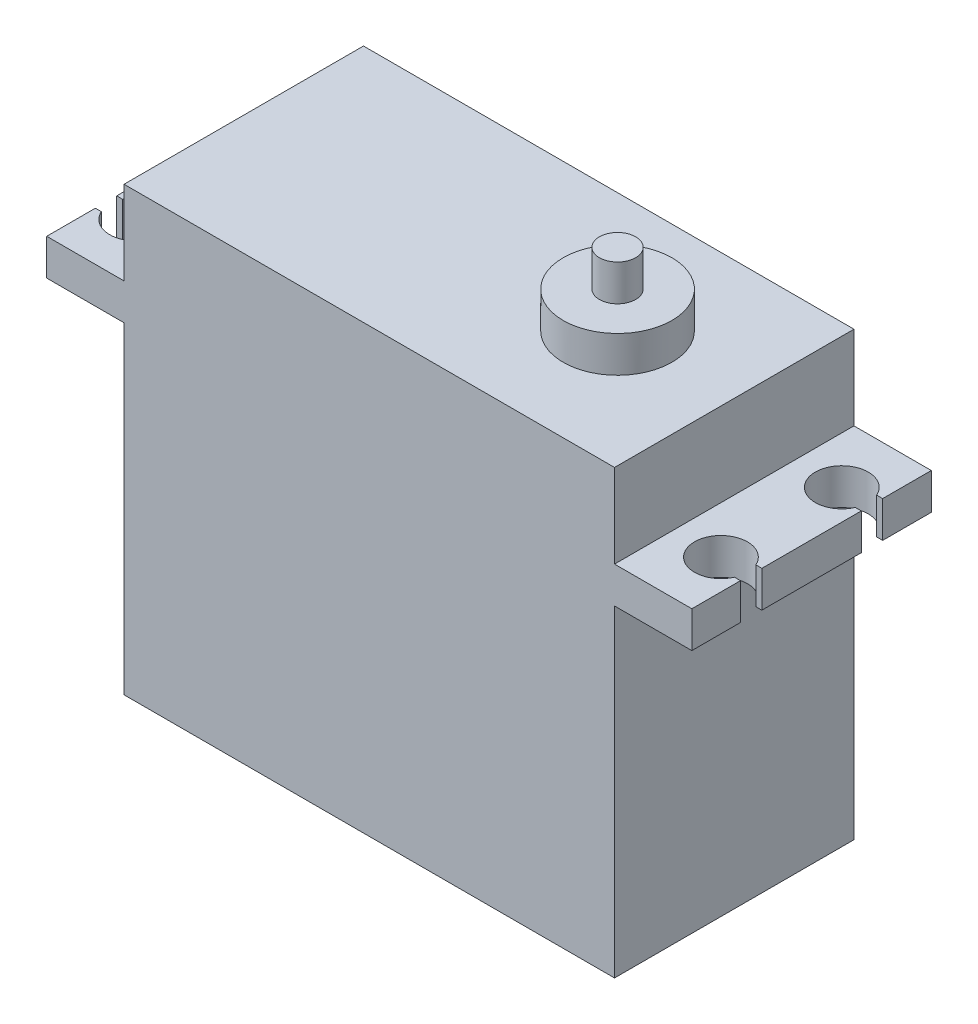
ISO-10303-21;
HEADER;
FILE_DESCRIPTION(('STEP AP214'),'2;1');
FILE_NAME('part.step','',(''),(''),'','','');
FILE_SCHEMA(('AUTOMOTIVE_DESIGN { 1 0 10303 214 1 1 1 1 }'));
ENDSEC;
DATA;
#1=APPLICATION_CONTEXT('core data for automotive mechanical design processes');
#2=APPLICATION_PROTOCOL_DEFINITION('international standard','automotive_design',2000,#1);
#3=PRODUCT_CONTEXT('',#1,'mechanical');
#4=PRODUCT('Part','Part','',(#3));
#5=PRODUCT_RELATED_PRODUCT_CATEGORY('part','',(#4));
#6=PRODUCT_DEFINITION_FORMATION('','',#4);
#7=PRODUCT_DEFINITION_CONTEXT('part definition',#1,'design');
#8=PRODUCT_DEFINITION('design','',#6,#7);
#9=PRODUCT_DEFINITION_SHAPE('','',#8);
#10=(LENGTH_UNIT() NAMED_UNIT(*) SI_UNIT(.MILLI.,.METRE.));
#11=(NAMED_UNIT(*) PLANE_ANGLE_UNIT() SI_UNIT($,.RADIAN.));
#12=(NAMED_UNIT(*) SI_UNIT($,.STERADIAN.) SOLID_ANGLE_UNIT());
#13=UNCERTAINTY_MEASURE_WITH_UNIT(LENGTH_MEASURE(1.E-05),#10,'distance_accuracy_value','');
#14=(GEOMETRIC_REPRESENTATION_CONTEXT(3) GLOBAL_UNCERTAINTY_ASSIGNED_CONTEXT((#13)) GLOBAL_UNIT_ASSIGNED_CONTEXT((#10,
#11,#12)) REPRESENTATION_CONTEXT('',''));
#15=CARTESIAN_POINT('',(0.,0.,0.));
#16=DIRECTION('',(0.,0.,1.));
#17=DIRECTION('',(1.,0.,0.));
#18=AXIS2_PLACEMENT_3D('',#15,#16,#17);
#19=CARTESIAN_POINT('',(0.,36.6,0.));
#20=DIRECTION('',(0.,-1.,0.));
#21=DIRECTION('',(0.,0.,-1.));
#22=AXIS2_PLACEMENT_3D('',#19,#20,#21);
#23=PLANE('',#22);
#24=DIRECTION('',(0.,0.,1.));
#25=VECTOR('',#24,1.);
#26=CARTESIAN_POINT('',(-46.3906393290634,36.6,5.61978732543846));
#27=LINE('',#26,#25);
#28=CARTESIAN_POINT('',(-46.3906393290634,36.6,5.61978732543846));
#29=VERTEX_POINT('',#28);
#30=CARTESIAN_POINT('',(-46.3906393290634,36.6,25.4397873254385));
#31=VERTEX_POINT('',#30);
#32=EDGE_CURVE('E402',#29,#31,#27,.T.);
#33=ORIENTED_EDGE('',*,*,#32,.T.);
#34=DIRECTION('',(1.,0.,0.));
#35=VECTOR('',#34,1.);
#36=CARTESIAN_POINT('',(-5.7906393290634,36.6,25.4397873254385));
#37=LINE('',#36,#35);
#38=CARTESIAN_POINT('',(-5.7906393290634,36.6,25.4397873254385));
#39=VERTEX_POINT('',#38);
#40=EDGE_CURVE('E405',#31,#39,#37,.T.);
#41=ORIENTED_EDGE('',*,*,#40,.T.);
#42=DIRECTION('',(0.,0.,-1.));
#43=VECTOR('',#42,1.);
#44=CARTESIAN_POINT('',(-5.7906393290634,36.6,5.61978732543845));
#45=LINE('',#44,#43);
#46=CARTESIAN_POINT('',(-5.7906393290634,36.6,5.61978732543845));
#47=VERTEX_POINT('',#46);
#48=EDGE_CURVE('E408',#39,#47,#45,.T.);
#49=ORIENTED_EDGE('',*,*,#48,.T.);
#50=DIRECTION('',(-1.,0.,0.));
#51=VECTOR('',#50,1.);
#52=CARTESIAN_POINT('',(-5.7906393290634,36.6,5.61978732543845));
#53=LINE('',#52,#51);
#54=EDGE_CURVE('E410',#47,#29,#53,.T.);
#55=ORIENTED_EDGE('',*,*,#54,.T.);
#56=EDGE_LOOP('',(#33,#41,#49,#55));
#57=FACE_BOUND('',#56,.T.);
#58=CARTESIAN_POINT('',(-15.4506393290634,36.6,15.5297873254385));
#59=DIRECTION('',(0.,-1.,0.));
#60=DIRECTION('',(0.,0.,-1.));
#61=AXIS2_PLACEMENT_3D('',#58,#59,#60);
#62=CIRCLE('',#61,4.5);
#63=CARTESIAN_POINT('',(-15.4506393290634,36.6,11.0297873254385));
#64=VERTEX_POINT('',#63);
#65=EDGE_CURVE('E11',#64,#64,#62,.F.);
#66=ORIENTED_EDGE('',*,*,#65,.F.);
#67=EDGE_LOOP('',(#66));
#68=FACE_BOUND('',#67,.T.);
#69=ADVANCED_FACE('F35',(#57,#68),#23,.F.);
#70=CARTESIAN_POINT('',(-5.7906393290634,36.6,5.61978732543845));
#71=DIRECTION('',(-1.,0.,0.));
#72=DIRECTION('',(0.,0.,1.));
#73=AXIS2_PLACEMENT_3D('',#70,#71,#72);
#74=PLANE('',#73);
#75=DIRECTION('',(0.,0.,1.));
#76=VECTOR('',#75,1.);
#77=CARTESIAN_POINT('',(-5.7906393290634,29.67,0.));
#78=LINE('',#77,#76);
#79=CARTESIAN_POINT('',(-5.7906393290634,29.67,5.61978732543845));
#80=VERTEX_POINT('',#79);
#81=CARTESIAN_POINT('',(-5.7906393290634,29.67,25.4397873254385));
#82=VERTEX_POINT('',#81);
#83=EDGE_CURVE('E254',#80,#82,#78,.T.);
#84=ORIENTED_EDGE('',*,*,#83,.F.);
#85=DIRECTION('',(0.,-1.,0.));
#86=VECTOR('',#85,1.);
#87=CARTESIAN_POINT('',(-5.7906393290634,36.6,5.61978732543845));
#88=LINE('',#87,#86);
#89=EDGE_CURVE('E436',#47,#80,#88,.T.);
#90=ORIENTED_EDGE('',*,*,#89,.F.);
#91=ORIENTED_EDGE('',*,*,#48,.F.);
#92=DIRECTION('',(0.,-1.,0.));
#93=VECTOR('',#92,1.);
#94=CARTESIAN_POINT('',(-5.7906393290634,36.6,25.4397873254385));
#95=LINE('',#94,#93);
#96=EDGE_CURVE('E429',#39,#82,#95,.T.);
#97=ORIENTED_EDGE('',*,*,#96,.T.);
#98=EDGE_LOOP('',(#84,#90,#91,#97));
#99=FACE_BOUND('',#98,.T.);
#100=ADVANCED_FACE('F505',(#99),#74,.F.);
#101=CARTESIAN_POINT('',(-46.3906393290634,36.6,5.61978732543846));
#102=DIRECTION('',(1.,0.,0.));
#103=DIRECTION('',(0.,0.,-1.));
#104=AXIS2_PLACEMENT_3D('',#101,#102,#103);
#105=PLANE('',#104);
#106=DIRECTION('',(0.,0.,-1.));
#107=VECTOR('',#106,1.);
#108=CARTESIAN_POINT('',(-46.3906393290634,29.67,0.));
#109=LINE('',#108,#107);
#110=CARTESIAN_POINT('',(-46.3906393290634,29.67,25.4397873254385));
#111=VERTEX_POINT('',#110);
#112=CARTESIAN_POINT('',(-46.3906393290634,29.67,5.61978732543846));
#113=VERTEX_POINT('',#112);
#114=EDGE_CURVE('E339',#111,#113,#109,.T.);
#115=ORIENTED_EDGE('',*,*,#114,.F.);
#116=DIRECTION('',(0.,-1.,0.));
#117=VECTOR('',#116,1.);
#118=CARTESIAN_POINT('',(-46.3906393290634,36.6,25.4397873254385));
#119=LINE('',#118,#117);
#120=EDGE_CURVE('E43',#31,#111,#119,.T.);
#121=ORIENTED_EDGE('',*,*,#120,.F.);
#122=ORIENTED_EDGE('',*,*,#32,.F.);
#123=DIRECTION('',(0.,-1.,0.));
#124=VECTOR('',#123,1.);
#125=CARTESIAN_POINT('',(-46.3906393290634,36.6,5.61978732543846));
#126=LINE('',#125,#124);
#127=EDGE_CURVE('E424',#29,#113,#126,.T.);
#128=ORIENTED_EDGE('',*,*,#127,.T.);
#129=EDGE_LOOP('',(#115,#121,#122,#128));
#130=FACE_BOUND('',#129,.T.);
#131=ADVANCED_FACE('F511',(#130),#105,.F.);
#132=CARTESIAN_POINT('',(-46.3906393290634,26.67,25.4397873254385));
#133=VERTEX_POINT('',#132);
#134=CARTESIAN_POINT('',(-46.3906393290634,0.,25.4397873254385));
#135=VERTEX_POINT('',#134);
#136=EDGE_CURVE('E426',#133,#135,#119,.T.);
#137=ORIENTED_EDGE('',*,*,#136,.F.);
#138=DIRECTION('',(0.,0.,-1.));
#139=VECTOR('',#138,1.);
#140=CARTESIAN_POINT('',(-46.3906393290634,26.67,0.));
#141=LINE('',#140,#139);
#142=CARTESIAN_POINT('',(-46.3906393290634,26.67,5.61978732543846));
#143=VERTEX_POINT('',#142);
#144=EDGE_CURVE('E359',#133,#143,#141,.T.);
#145=ORIENTED_EDGE('',*,*,#144,.T.);
#146=CARTESIAN_POINT('',(-46.3906393290634,0.,5.61978732543846));
#147=VERTEX_POINT('',#146);
#148=EDGE_CURVE('E344',#143,#147,#126,.T.);
#149=ORIENTED_EDGE('',*,*,#148,.T.);
#150=DIRECTION('',(0.,0.,1.));
#151=VECTOR('',#150,1.);
#152=CARTESIAN_POINT('',(-46.3906393290634,0.,5.61978732543846));
#153=LINE('',#152,#151);
#154=EDGE_CURVE('E401',#147,#135,#153,.T.);
#155=ORIENTED_EDGE('',*,*,#154,.T.);
#156=EDGE_LOOP('',(#137,#145,#149,#155));
#157=FACE_BOUND('',#156,.T.);
#158=ADVANCED_FACE('F37',(#157),#105,.F.);
#159=CARTESIAN_POINT('',(-5.7906393290634,36.6,25.4397873254385));
#160=DIRECTION('',(0.,0.,-1.));
#161=DIRECTION('',(-1.,0.,0.));
#162=AXIS2_PLACEMENT_3D('',#159,#160,#161);
#163=PLANE('',#162);
#164=DIRECTION('',(1.,0.,0.));
#165=VECTOR('',#164,1.);
#166=CARTESIAN_POINT('',(-5.7906393290634,0.,25.4397873254385));
#167=LINE('',#166,#165);
#168=CARTESIAN_POINT('',(-5.7906393290634,0.,25.4397873254385));
#169=VERTEX_POINT('',#168);
#170=EDGE_CURVE('E414',#135,#169,#167,.T.);
#171=ORIENTED_EDGE('',*,*,#170,.T.);
#172=CARTESIAN_POINT('',(-5.7906393290634,26.67,25.4397873254385));
#173=VERTEX_POINT('',#172);
#174=EDGE_CURVE('E259',#173,#169,#95,.T.);
#175=ORIENTED_EDGE('',*,*,#174,.F.);
#176=DIRECTION('',(1.,0.,0.));
#177=VECTOR('',#176,1.);
#178=CARTESIAN_POINT('',(0.,26.67,25.4397873254385));
#179=LINE('',#178,#177);
#180=CARTESIAN_POINT('',(0.609360670936598,26.67,25.4397873254385));
#181=VERTEX_POINT('',#180);
#182=EDGE_CURVE('E272',#173,#181,#179,.T.);
#183=ORIENTED_EDGE('',*,*,#182,.T.);
#184=DIRECTION('',(0.,-1.,0.));
#185=VECTOR('',#184,1.);
#186=CARTESIAN_POINT('',(0.609360670936598,29.67,25.4397873254385));
#187=LINE('',#186,#185);
#188=CARTESIAN_POINT('',(0.609360670936598,29.67,25.4397873254385));
#189=VERTEX_POINT('',#188);
#190=EDGE_CURVE('E310',#189,#181,#187,.T.);
#191=ORIENTED_EDGE('',*,*,#190,.F.);
#192=DIRECTION('',(1.,0.,0.));
#193=VECTOR('',#192,1.);
#194=CARTESIAN_POINT('',(0.,29.67,25.4397873254385));
#195=LINE('',#194,#193);
#196=EDGE_CURVE('E245',#82,#189,#195,.T.);
#197=ORIENTED_EDGE('',*,*,#196,.F.);
#198=ORIENTED_EDGE('',*,*,#96,.F.);
#199=ORIENTED_EDGE('',*,*,#40,.F.);
#200=ORIENTED_EDGE('',*,*,#120,.T.);
#201=DIRECTION('',(1.,0.,0.));
#202=VECTOR('',#201,1.);
#203=CARTESIAN_POINT('',(0.,29.67,25.4397873254385));
#204=LINE('',#203,#202);
#205=CARTESIAN_POINT('',(-52.7906393290634,29.67,25.4397873254385));
#206=VERTEX_POINT('',#205);
#207=EDGE_CURVE('E343',#206,#111,#204,.T.);
#208=ORIENTED_EDGE('',*,*,#207,.F.);
#209=DIRECTION('',(0.,-1.,0.));
#210=VECTOR('',#209,1.);
#211=CARTESIAN_POINT('',(-52.7906393290634,29.67,25.4397873254385));
#212=LINE('',#211,#210);
#213=CARTESIAN_POINT('',(-52.7906393290634,26.67,25.4397873254385));
#214=VERTEX_POINT('',#213);
#215=EDGE_CURVE('E381',#206,#214,#212,.T.);
#216=ORIENTED_EDGE('',*,*,#215,.T.);
#217=DIRECTION('',(1.,0.,0.));
#218=VECTOR('',#217,1.);
#219=CARTESIAN_POINT('',(0.,26.67,25.4397873254385));
#220=LINE('',#219,#218);
#221=EDGE_CURVE('E355',#214,#133,#220,.T.);
#222=ORIENTED_EDGE('',*,*,#221,.T.);
#223=ORIENTED_EDGE('',*,*,#136,.T.);
#224=EDGE_LOOP('',(#171,#175,#183,#191,#197,#198,#199,#200,#208,#216,#222,#223));
#225=FACE_BOUND('',#224,.T.);
#226=ADVANCED_FACE('F450',(#225),#163,.F.);
#227=CARTESIAN_POINT('',(-5.7906393290634,26.67,5.61978732543845));
#228=VERTEX_POINT('',#227);
#229=CARTESIAN_POINT('',(-5.7906393290634,0.,5.61978732543845));
#230=VERTEX_POINT('',#229);
#231=EDGE_CURVE('E55',#228,#230,#88,.T.);
#232=ORIENTED_EDGE('',*,*,#231,.F.);
#233=DIRECTION('',(0.,0.,1.));
#234=VECTOR('',#233,1.);
#235=CARTESIAN_POINT('',(-5.7906393290634,26.67,0.));
#236=LINE('',#235,#234);
#237=EDGE_CURVE('E50',#228,#173,#236,.T.);
#238=ORIENTED_EDGE('',*,*,#237,.T.);
#239=ORIENTED_EDGE('',*,*,#174,.T.);
#240=DIRECTION('',(0.,0.,-1.));
#241=VECTOR('',#240,1.);
#242=CARTESIAN_POINT('',(-5.7906393290634,0.,5.61978732543845));
#243=LINE('',#242,#241);
#244=EDGE_CURVE('E417',#169,#230,#243,.T.);
#245=ORIENTED_EDGE('',*,*,#244,.T.);
#246=EDGE_LOOP('',(#232,#238,#239,#245));
#247=FACE_BOUND('',#246,.T.);
#248=ADVANCED_FACE('F443',(#247),#74,.F.);
#249=CARTESIAN_POINT('',(-5.7906393290634,36.6,5.61978732543845));
#250=DIRECTION('',(0.,0.,1.));
#251=DIRECTION('',(1.,0.,0.));
#252=AXIS2_PLACEMENT_3D('',#249,#250,#251);
#253=PLANE('',#252);
#254=DIRECTION('',(-1.,0.,0.));
#255=VECTOR('',#254,1.);
#256=CARTESIAN_POINT('',(-5.7906393290634,0.,5.61978732543845));
#257=LINE('',#256,#255);
#258=EDGE_CURVE('E406',#230,#147,#257,.T.);
#259=ORIENTED_EDGE('',*,*,#258,.T.);
#260=ORIENTED_EDGE('',*,*,#148,.F.);
#261=DIRECTION('',(1.,0.,0.));
#262=VECTOR('',#261,1.);
#263=CARTESIAN_POINT('',(0.,26.67,5.61978732543846));
#264=LINE('',#263,#262);
#265=CARTESIAN_POINT('',(-52.7906393290634,26.67,5.61978732543846));
#266=VERTEX_POINT('',#265);
#267=EDGE_CURVE('E364',#266,#143,#264,.T.);
#268=ORIENTED_EDGE('',*,*,#267,.F.);
#269=DIRECTION('',(0.,-1.,0.));
#270=VECTOR('',#269,1.);
#271=CARTESIAN_POINT('',(-52.7906393290634,29.67,5.61978732543846));
#272=LINE('',#271,#270);
#273=CARTESIAN_POINT('',(-52.7906393290634,29.67,5.61978732543846));
#274=VERTEX_POINT('',#273);
#275=EDGE_CURVE('E383',#274,#266,#272,.T.);
#276=ORIENTED_EDGE('',*,*,#275,.F.);
#277=DIRECTION('',(1.,0.,0.));
#278=VECTOR('',#277,1.);
#279=CARTESIAN_POINT('',(0.,29.67,5.61978732543846));
#280=LINE('',#279,#278);
#281=EDGE_CURVE('E333',#274,#113,#280,.T.);
#282=ORIENTED_EDGE('',*,*,#281,.T.);
#283=ORIENTED_EDGE('',*,*,#127,.F.);
#284=ORIENTED_EDGE('',*,*,#54,.F.);
#285=ORIENTED_EDGE('',*,*,#89,.T.);
#286=DIRECTION('',(1.,0.,0.));
#287=VECTOR('',#286,1.);
#288=CARTESIAN_POINT('',(0.,29.67,5.61978732543846));
#289=LINE('',#288,#287);
#290=CARTESIAN_POINT('',(0.6093606709366,29.67,5.61978732543846));
#291=VERTEX_POINT('',#290);
#292=EDGE_CURVE('E258',#80,#291,#289,.T.);
#293=ORIENTED_EDGE('',*,*,#292,.T.);
#294=DIRECTION('',(0.,-1.,0.));
#295=VECTOR('',#294,1.);
#296=CARTESIAN_POINT('',(0.6093606709366,29.67,5.61978732543846));
#297=LINE('',#296,#295);
#298=CARTESIAN_POINT('',(0.6093606709366,26.67,5.61978732543846));
#299=VERTEX_POINT('',#298);
#300=EDGE_CURVE('E308',#291,#299,#297,.T.);
#301=ORIENTED_EDGE('',*,*,#300,.T.);
#302=DIRECTION('',(1.,0.,0.));
#303=VECTOR('',#302,1.);
#304=CARTESIAN_POINT('',(0.,26.67,5.61978732543846));
#305=LINE('',#304,#303);
#306=EDGE_CURVE('E271',#228,#299,#305,.T.);
#307=ORIENTED_EDGE('',*,*,#306,.F.);
#308=ORIENTED_EDGE('',*,*,#231,.T.);
#309=EDGE_LOOP('',(#259,#260,#268,#276,#282,#283,#284,#285,#293,#301,#307,#308));
#310=FACE_BOUND('',#309,.T.);
#311=ADVANCED_FACE('F455',(#310),#253,.F.);
#312=CARTESIAN_POINT('',(0.,0.,0.));
#313=DIRECTION('',(0.,-1.,0.));
#314=DIRECTION('',(0.,0.,-1.));
#315=AXIS2_PLACEMENT_3D('',#312,#313,#314);
#316=PLANE('',#315);
#317=ORIENTED_EDGE('',*,*,#154,.F.);
#318=ORIENTED_EDGE('',*,*,#258,.F.);
#319=ORIENTED_EDGE('',*,*,#244,.F.);
#320=ORIENTED_EDGE('',*,*,#170,.F.);
#321=EDGE_LOOP('',(#317,#318,#319,#320));
#322=FACE_BOUND('',#321,.T.);
#323=ADVANCED_FACE('F453',(#322),#316,.T.);
#324=CARTESIAN_POINT('',(-50.2906393290634,29.67,20.5297873254385));
#325=DIRECTION('',(0.,-1.,0.));
#326=DIRECTION('',(0.,0.,-1.));
#327=AXIS2_PLACEMENT_3D('',#324,#325,#326);
#328=CYLINDRICAL_SURFACE('',#327,2.19);
#329=CARTESIAN_POINT('',(-50.2906393290634,26.67,20.5297873254385));
#330=DIRECTION('',(0.,-1.,0.));
#331=DIRECTION('',(0.,0.,-1.));
#332=AXIS2_PLACEMENT_3D('',#329,#330,#331);
#333=CIRCLE('',#332,2.19);
#334=CARTESIAN_POINT('',(-52.2939527174455,26.67,19.6450074274249));
#335=VERTEX_POINT('',#334);
#336=CARTESIAN_POINT('',(-52.2939527174455,26.67,21.414567223452));
#337=VERTEX_POINT('',#336);
#338=EDGE_CURVE('E296',#335,#337,#333,.T.);
#339=ORIENTED_EDGE('',*,*,#338,.T.);
#340=DIRECTION('',(0.,-1.,0.));
#341=VECTOR('',#340,1.);
#342=CARTESIAN_POINT('',(-52.2939527174455,29.67,21.414567223452));
#343=LINE('',#342,#341);
#344=CARTESIAN_POINT('',(-52.2939527174455,29.67,21.414567223452));
#345=VERTEX_POINT('',#344);
#346=EDGE_CURVE('E375',#345,#337,#343,.T.);
#347=ORIENTED_EDGE('',*,*,#346,.F.);
#348=CARTESIAN_POINT('',(-50.2906393290634,29.67,20.5297873254385));
#349=DIRECTION('',(0.,-1.,0.));
#350=DIRECTION('',(0.,0.,-1.));
#351=AXIS2_PLACEMENT_3D('',#348,#349,#350);
#352=CIRCLE('',#351,2.19);
#353=CARTESIAN_POINT('',(-52.2939527174455,29.67,19.6450074274249));
#354=VERTEX_POINT('',#353);
#355=EDGE_CURVE('E313',#354,#345,#352,.T.);
#356=ORIENTED_EDGE('',*,*,#355,.F.);
#357=DIRECTION('',(0.,-1.,0.));
#358=VECTOR('',#357,1.);
#359=CARTESIAN_POINT('',(-52.2939527174455,29.67,19.6450074274249));
#360=LINE('',#359,#358);
#361=EDGE_CURVE('E396',#354,#335,#360,.T.);
#362=ORIENTED_EDGE('',*,*,#361,.T.);
#363=EDGE_LOOP('',(#339,#347,#356,#362));
#364=FACE_BOUND('',#363,.T.);
#365=ADVANCED_FACE('F520',(#364),#328,.F.);
#366=CARTESIAN_POINT('',(-1.49584674204944E-13,29.67,21.4145672234524));
#367=DIRECTION('',(0.,0.,1.));
#368=DIRECTION('',(1.,0.,0.));
#369=AXIS2_PLACEMENT_3D('',#366,#367,#368);
#370=PLANE('',#369);
#371=DIRECTION('',(-1.,0.,0.));
#372=VECTOR('',#371,1.);
#373=CARTESIAN_POINT('',(-1.49584674204944E-13,26.67,21.4145672234524));
#374=LINE('',#373,#372);
#375=CARTESIAN_POINT('',(-52.7906393290634,26.67,21.414567223452));
#376=VERTEX_POINT('',#375);
#377=EDGE_CURVE('E317',#337,#376,#374,.T.);
#378=ORIENTED_EDGE('',*,*,#377,.T.);
#379=DIRECTION('',(0.,-1.,0.));
#380=VECTOR('',#379,1.);
#381=CARTESIAN_POINT('',(-52.7906393290634,29.67,21.414567223452));
#382=LINE('',#381,#380);
#383=CARTESIAN_POINT('',(-52.7906393290634,29.67,21.414567223452));
#384=VERTEX_POINT('',#383);
#385=EDGE_CURVE('E379',#384,#376,#382,.T.);
#386=ORIENTED_EDGE('',*,*,#385,.F.);
#387=DIRECTION('',(-1.,0.,0.));
#388=VECTOR('',#387,1.);
#389=CARTESIAN_POINT('',(-1.49584674204944E-13,29.67,21.4145672234524));
#390=LINE('',#389,#388);
#391=EDGE_CURVE('E398',#345,#384,#390,.T.);
#392=ORIENTED_EDGE('',*,*,#391,.F.);
#393=ORIENTED_EDGE('',*,*,#346,.T.);
#394=EDGE_LOOP('',(#378,#386,#392,#393));
#395=FACE_BOUND('',#394,.T.);
#396=ADVANCED_FACE('F597',(#395),#370,.F.);
#397=CARTESIAN_POINT('',(-52.7906393290634,29.67,0.));
#398=DIRECTION('',(-1.,0.,0.));
#399=DIRECTION('',(0.,0.,1.));
#400=AXIS2_PLACEMENT_3D('',#397,#398,#399);
#401=PLANE('',#400);
#402=DIRECTION('',(0.,0.,-1.));
#403=VECTOR('',#402,1.);
#404=CARTESIAN_POINT('',(-52.7906393290634,26.67,0.));
#405=LINE('',#404,#403);
#406=EDGE_CURVE('E358',#214,#376,#405,.T.);
#407=ORIENTED_EDGE('',*,*,#406,.F.);
#408=ORIENTED_EDGE('',*,*,#215,.F.);
#409=DIRECTION('',(0.,0.,-1.));
#410=VECTOR('',#409,1.);
#411=CARTESIAN_POINT('',(-52.7906393290634,29.67,0.));
#412=LINE('',#411,#410);
#413=EDGE_CURVE('E336',#206,#384,#412,.T.);
#414=ORIENTED_EDGE('',*,*,#413,.T.);
#415=ORIENTED_EDGE('',*,*,#385,.T.);
#416=EDGE_LOOP('',(#407,#408,#414,#415));
#417=FACE_BOUND('',#416,.T.);
#418=ADVANCED_FACE('F563',(#417),#401,.T.);
#419=CARTESIAN_POINT('',(-52.7906393290634,29.67,0.));
#420=DIRECTION('',(-1.,0.,0.));
#421=DIRECTION('',(0.,0.,1.));
#422=AXIS2_PLACEMENT_3D('',#419,#420,#421);
#423=PLANE('',#422);
#424=DIRECTION('',(0.,0.,-1.));
#425=VECTOR('',#424,1.);
#426=CARTESIAN_POINT('',(-52.7906393290634,26.67,0.));
#427=LINE('',#426,#425);
#428=CARTESIAN_POINT('',(-52.7906393290634,26.67,9.64500742742492));
#429=VERTEX_POINT('',#428);
#430=EDGE_CURVE('E369',#429,#266,#427,.T.);
#431=ORIENTED_EDGE('',*,*,#430,.F.);
#432=DIRECTION('',(0.,-1.,0.));
#433=VECTOR('',#432,1.);
#434=CARTESIAN_POINT('',(-52.7906393290634,29.67,9.64500742742492));
#435=LINE('',#434,#433);
#436=CARTESIAN_POINT('',(-52.7906393290634,29.67,9.64500742742492));
#437=VERTEX_POINT('',#436);
#438=EDGE_CURVE('E385',#437,#429,#435,.T.);
#439=ORIENTED_EDGE('',*,*,#438,.F.);
#440=DIRECTION('',(0.,0.,-1.));
#441=VECTOR('',#440,1.);
#442=CARTESIAN_POINT('',(-52.7906393290634,29.67,0.));
#443=LINE('',#442,#441);
#444=EDGE_CURVE('E330',#437,#274,#443,.T.);
#445=ORIENTED_EDGE('',*,*,#444,.T.);
#446=ORIENTED_EDGE('',*,*,#275,.T.);
#447=EDGE_LOOP('',(#431,#439,#445,#446));
#448=FACE_BOUND('',#447,.T.);
#449=ADVANCED_FACE('F573',(#448),#423,.T.);
#450=CARTESIAN_POINT('',(0.,29.67,9.64500742742492));
#451=DIRECTION('',(0.,0.,1.));
#452=DIRECTION('',(1.,0.,0.));
#453=AXIS2_PLACEMENT_3D('',#450,#451,#452);
#454=PLANE('',#453);
#455=DIRECTION('',(-1.,0.,0.));
#456=VECTOR('',#455,1.);
#457=CARTESIAN_POINT('',(0.,26.67,9.64500742742492));
#458=LINE('',#457,#456);
#459=CARTESIAN_POINT('',(-52.2939527174455,26.67,9.64500742742492));
#460=VERTEX_POINT('',#459);
#461=EDGE_CURVE('E542',#460,#429,#458,.T.);
#462=ORIENTED_EDGE('',*,*,#461,.F.);
#463=DIRECTION('',(0.,-1.,0.));
#464=VECTOR('',#463,1.);
#465=CARTESIAN_POINT('',(-52.2939527174455,29.67,9.64500742742492));
#466=LINE('',#465,#464);
#467=CARTESIAN_POINT('',(-52.2939527174455,29.67,9.64500742742492));
#468=VERTEX_POINT('',#467);
#469=EDGE_CURVE('E387',#468,#460,#466,.T.);
#470=ORIENTED_EDGE('',*,*,#469,.F.);
#471=DIRECTION('',(-1.,0.,0.));
#472=VECTOR('',#471,1.);
#473=CARTESIAN_POINT('',(0.,29.67,9.64500742742492));
#474=LINE('',#473,#472);
#475=EDGE_CURVE('E327',#468,#437,#474,.T.);
#476=ORIENTED_EDGE('',*,*,#475,.T.);
#477=ORIENTED_EDGE('',*,*,#438,.T.);
#478=EDGE_LOOP('',(#462,#470,#476,#477));
#479=FACE_BOUND('',#478,.T.);
#480=ADVANCED_FACE('F575',(#479),#454,.T.);
#481=CARTESIAN_POINT('',(-50.2906393290634,29.67,10.5297873254385));
#482=DIRECTION('',(0.,-1.,0.));
#483=DIRECTION('',(0.,0.,-1.));
#484=AXIS2_PLACEMENT_3D('',#481,#482,#483);
#485=CYLINDRICAL_SURFACE('',#484,2.19);
#486=CARTESIAN_POINT('',(-50.2906393290634,26.67,10.5297873254385));
#487=DIRECTION('',(0.,-1.,0.));
#488=DIRECTION('',(0.,0.,-1.));
#489=AXIS2_PLACEMENT_3D('',#486,#487,#488);
#490=CIRCLE('',#489,2.19);
#491=CARTESIAN_POINT('',(-52.2939527174455,26.67,11.414567223452));
#492=VERTEX_POINT('',#491);
#493=EDGE_CURVE('E543',#460,#492,#490,.T.);
#494=ORIENTED_EDGE('',*,*,#493,.T.);
#495=DIRECTION('',(0.,-1.,0.));
#496=VECTOR('',#495,1.);
#497=CARTESIAN_POINT('',(-52.2939527174455,29.67,11.414567223452));
#498=LINE('',#497,#496);
#499=CARTESIAN_POINT('',(-52.2939527174455,29.67,11.414567223452));
#500=VERTEX_POINT('',#499);
#501=EDGE_CURVE('E389',#500,#492,#498,.T.);
#502=ORIENTED_EDGE('',*,*,#501,.F.);
#503=CARTESIAN_POINT('',(-50.2906393290634,29.67,10.5297873254385));
#504=DIRECTION('',(0.,-1.,0.));
#505=DIRECTION('',(0.,0.,-1.));
#506=AXIS2_PLACEMENT_3D('',#503,#504,#505);
#507=CIRCLE('',#506,2.19);
#508=EDGE_CURVE('E325',#468,#500,#507,.T.);
#509=ORIENTED_EDGE('',*,*,#508,.F.);
#510=ORIENTED_EDGE('',*,*,#469,.T.);
#511=EDGE_LOOP('',(#494,#502,#509,#510));
#512=FACE_BOUND('',#511,.T.);
#513=ADVANCED_FACE('F582',(#512),#485,.F.);
#514=CARTESIAN_POINT('',(0.,29.67,11.4145672234522));
#515=DIRECTION('',(0.,0.,1.));
#516=DIRECTION('',(1.,0.,0.));
#517=AXIS2_PLACEMENT_3D('',#514,#515,#516);
#518=PLANE('',#517);
#519=DIRECTION('',(-1.,0.,0.));
#520=VECTOR('',#519,1.);
#521=CARTESIAN_POINT('',(0.,26.67,11.4145672234522));
#522=LINE('',#521,#520);
#523=CARTESIAN_POINT('',(-52.7906393290634,26.67,11.414567223452));
#524=VERTEX_POINT('',#523);
#525=EDGE_CURVE('E546',#492,#524,#522,.T.);
#526=ORIENTED_EDGE('',*,*,#525,.T.);
#527=DIRECTION('',(0.,-1.,0.));
#528=VECTOR('',#527,1.);
#529=CARTESIAN_POINT('',(-52.7906393290634,29.67,11.414567223452));
#530=LINE('',#529,#528);
#531=CARTESIAN_POINT('',(-52.7906393290634,29.67,11.414567223452));
#532=VERTEX_POINT('',#531);
#533=EDGE_CURVE('E392',#532,#524,#530,.T.);
#534=ORIENTED_EDGE('',*,*,#533,.F.);
#535=DIRECTION('',(-1.,0.,0.));
#536=VECTOR('',#535,1.);
#537=CARTESIAN_POINT('',(0.,29.67,11.4145672234522));
#538=LINE('',#537,#536);
#539=EDGE_CURVE('E323',#500,#532,#538,.T.);
#540=ORIENTED_EDGE('',*,*,#539,.F.);
#541=ORIENTED_EDGE('',*,*,#501,.T.);
#542=EDGE_LOOP('',(#526,#534,#540,#541));
#543=FACE_BOUND('',#542,.T.);
#544=ADVANCED_FACE('F585',(#543),#518,.F.);
#545=CARTESIAN_POINT('',(-52.7906393290634,29.67,0.));
#546=DIRECTION('',(-1.,0.,0.));
#547=DIRECTION('',(0.,0.,1.));
#548=AXIS2_PLACEMENT_3D('',#545,#546,#547);
#549=PLANE('',#548);
#550=DIRECTION('',(0.,0.,-1.));
#551=VECTOR('',#550,1.);
#552=CARTESIAN_POINT('',(-52.7906393290634,26.67,0.));
#553=LINE('',#552,#551);
#554=CARTESIAN_POINT('',(-52.7906393290634,26.67,19.6450074274249));
#555=VERTEX_POINT('',#554);
#556=EDGE_CURVE('E551',#555,#524,#553,.T.);
#557=ORIENTED_EDGE('',*,*,#556,.F.);
#558=DIRECTION('',(0.,-1.,0.));
#559=VECTOR('',#558,1.);
#560=CARTESIAN_POINT('',(-52.7906393290634,29.67,19.6450074274249));
#561=LINE('',#560,#559);
#562=CARTESIAN_POINT('',(-52.7906393290634,29.67,19.6450074274249));
#563=VERTEX_POINT('',#562);
#564=EDGE_CURVE('E394',#563,#555,#561,.T.);
#565=ORIENTED_EDGE('',*,*,#564,.F.);
#566=DIRECTION('',(0.,0.,-1.));
#567=VECTOR('',#566,1.);
#568=CARTESIAN_POINT('',(-52.7906393290634,29.67,0.));
#569=LINE('',#568,#567);
#570=EDGE_CURVE('E320',#563,#532,#569,.T.);
#571=ORIENTED_EDGE('',*,*,#570,.T.);
#572=ORIENTED_EDGE('',*,*,#533,.T.);
#573=EDGE_LOOP('',(#557,#565,#571,#572));
#574=FACE_BOUND('',#573,.T.);
#575=ADVANCED_FACE('F588',(#574),#549,.T.);
#576=CARTESIAN_POINT('',(0.,29.67,19.6450074274249));
#577=DIRECTION('',(0.,0.,1.));
#578=DIRECTION('',(1.,0.,0.));
#579=AXIS2_PLACEMENT_3D('',#576,#577,#578);
#580=PLANE('',#579);
#581=DIRECTION('',(-1.,0.,0.));
#582=VECTOR('',#581,1.);
#583=CARTESIAN_POINT('',(0.,26.67,19.6450074274249));
#584=LINE('',#583,#582);
#585=EDGE_CURVE('E554',#335,#555,#584,.T.);
#586=ORIENTED_EDGE('',*,*,#585,.F.);
#587=ORIENTED_EDGE('',*,*,#361,.F.);
#588=DIRECTION('',(-1.,0.,0.));
#589=VECTOR('',#588,1.);
#590=CARTESIAN_POINT('',(0.,29.67,19.6450074274249));
#591=LINE('',#590,#589);
#592=EDGE_CURVE('E316',#354,#563,#591,.T.);
#593=ORIENTED_EDGE('',*,*,#592,.T.);
#594=ORIENTED_EDGE('',*,*,#564,.T.);
#595=EDGE_LOOP('',(#586,#587,#593,#594));
#596=FACE_BOUND('',#595,.T.);
#597=ADVANCED_FACE('F592',(#596),#580,.T.);
#598=CARTESIAN_POINT('',(0.,29.67,0.));
#599=DIRECTION('',(0.,-1.,0.));
#600=DIRECTION('',(0.,0.,-1.));
#601=AXIS2_PLACEMENT_3D('',#598,#599,#600);
#602=PLANE('',#601);
#603=ORIENTED_EDGE('',*,*,#355,.T.);
#604=ORIENTED_EDGE('',*,*,#391,.T.);
#605=ORIENTED_EDGE('',*,*,#413,.F.);
#606=ORIENTED_EDGE('',*,*,#207,.T.);
#607=ORIENTED_EDGE('',*,*,#114,.T.);
#608=ORIENTED_EDGE('',*,*,#281,.F.);
#609=ORIENTED_EDGE('',*,*,#444,.F.);
#610=ORIENTED_EDGE('',*,*,#475,.F.);
#611=ORIENTED_EDGE('',*,*,#508,.T.);
#612=ORIENTED_EDGE('',*,*,#539,.T.);
#613=ORIENTED_EDGE('',*,*,#570,.F.);
#614=ORIENTED_EDGE('',*,*,#592,.F.);
#615=EDGE_LOOP('',(#603,#604,#605,#606,#607,#608,#609,#610,#611,#612,#613,#614));
#616=FACE_BOUND('',#615,.T.);
#617=ADVANCED_FACE('F564',(#616),#602,.F.);
#618=CARTESIAN_POINT('',(0.,26.67,0.));
#619=DIRECTION('',(0.,-1.,0.));
#620=DIRECTION('',(0.,0.,-1.));
#621=AXIS2_PLACEMENT_3D('',#618,#619,#620);
#622=PLANE('',#621);
#623=ORIENTED_EDGE('',*,*,#338,.F.);
#624=ORIENTED_EDGE('',*,*,#585,.T.);
#625=ORIENTED_EDGE('',*,*,#556,.T.);
#626=ORIENTED_EDGE('',*,*,#525,.F.);
#627=ORIENTED_EDGE('',*,*,#493,.F.);
#628=ORIENTED_EDGE('',*,*,#461,.T.);
#629=ORIENTED_EDGE('',*,*,#430,.T.);
#630=ORIENTED_EDGE('',*,*,#267,.T.);
#631=ORIENTED_EDGE('',*,*,#144,.F.);
#632=ORIENTED_EDGE('',*,*,#221,.F.);
#633=ORIENTED_EDGE('',*,*,#406,.T.);
#634=ORIENTED_EDGE('',*,*,#377,.F.);
#635=EDGE_LOOP('',(#623,#624,#625,#626,#627,#628,#629,#630,#631,#632,#633,#634));
#636=FACE_BOUND('',#635,.T.);
#637=ADVANCED_FACE('F538',(#636),#622,.T.);
#638=CARTESIAN_POINT('',(-1.8906393290634,29.67,20.5297873254385));
#639=DIRECTION('',(0.,-1.,0.));
#640=DIRECTION('',(0.,0.,-1.));
#641=AXIS2_PLACEMENT_3D('',#638,#639,#640);
#642=CYLINDRICAL_SURFACE('',#641,2.19);
#643=CARTESIAN_POINT('',(-1.8906393290634,26.67,20.5297873254385));
#644=DIRECTION('',(0.,-1.,0.));
#645=DIRECTION('',(0.,0.,-1.));
#646=AXIS2_PLACEMENT_3D('',#643,#644,#645);
#647=CIRCLE('',#646,2.19);
#648=CARTESIAN_POINT('',(0.112674059318748,26.67,21.414567223452));
#649=VERTEX_POINT('',#648);
#650=CARTESIAN_POINT('',(0.112674059318748,26.67,19.6450074274249));
#651=VERTEX_POINT('',#650);
#652=EDGE_CURVE('E470',#649,#651,#647,.T.);
#653=ORIENTED_EDGE('',*,*,#652,.T.);
#654=DIRECTION('',(0.,-1.,0.));
#655=VECTOR('',#654,1.);
#656=CARTESIAN_POINT('',(0.112674059318748,29.67,19.6450074274249));
#657=LINE('',#656,#655);
#658=CARTESIAN_POINT('',(0.112674059318748,29.67,19.6450074274249));
#659=VERTEX_POINT('',#658);
#660=EDGE_CURVE('E236',#659,#651,#657,.T.);
#661=ORIENTED_EDGE('',*,*,#660,.F.);
#662=CARTESIAN_POINT('',(-1.8906393290634,29.67,20.5297873254385));
#663=DIRECTION('',(0.,-1.,0.));
#664=DIRECTION('',(0.,0.,-1.));
#665=AXIS2_PLACEMENT_3D('',#662,#663,#664);
#666=CIRCLE('',#665,2.19);
#667=CARTESIAN_POINT('',(0.112674059318748,29.67,21.414567223452));
#668=VERTEX_POINT('',#667);
#669=EDGE_CURVE('E233',#668,#659,#666,.T.);
#670=ORIENTED_EDGE('',*,*,#669,.F.);
#671=DIRECTION('',(0.,-1.,0.));
#672=VECTOR('',#671,1.);
#673=CARTESIAN_POINT('',(0.112674059318748,29.67,21.414567223452));
#674=LINE('',#673,#672);
#675=EDGE_CURVE('E218',#668,#649,#674,.T.);
#676=ORIENTED_EDGE('',*,*,#675,.T.);
#677=EDGE_LOOP('',(#653,#661,#670,#676));
#678=FACE_BOUND('',#677,.T.);
#679=ADVANCED_FACE('F234',(#678),#642,.F.);
#680=CARTESIAN_POINT('',(-1.37223974928948E-13,29.67,19.6450074274249));
#681=DIRECTION('',(0.,0.,-1.));
#682=DIRECTION('',(-1.,0.,0.));
#683=AXIS2_PLACEMENT_3D('',#680,#681,#682);
#684=PLANE('',#683);
#685=DIRECTION('',(1.,0.,0.));
#686=VECTOR('',#685,1.);
#687=CARTESIAN_POINT('',(-1.37223974928948E-13,26.67,19.6450074274249));
#688=LINE('',#687,#686);
#689=CARTESIAN_POINT('',(0.609360670936599,26.67,19.6450074274249));
#690=VERTEX_POINT('',#689);
#691=EDGE_CURVE('E238',#651,#690,#688,.T.);
#692=ORIENTED_EDGE('',*,*,#691,.T.);
#693=DIRECTION('',(0.,-1.,0.));
#694=VECTOR('',#693,1.);
#695=CARTESIAN_POINT('',(0.609360670936599,29.67,19.6450074274249));
#696=LINE('',#695,#694);
#697=CARTESIAN_POINT('',(0.609360670936599,29.67,19.6450074274249));
#698=VERTEX_POINT('',#697);
#699=EDGE_CURVE('E297',#698,#690,#696,.T.);
#700=ORIENTED_EDGE('',*,*,#699,.F.);
#701=DIRECTION('',(1.,0.,0.));
#702=VECTOR('',#701,1.);
#703=CARTESIAN_POINT('',(-1.37223974928948E-13,29.67,19.6450074274249));
#704=LINE('',#703,#702);
#705=EDGE_CURVE('E229',#659,#698,#704,.T.);
#706=ORIENTED_EDGE('',*,*,#705,.F.);
#707=ORIENTED_EDGE('',*,*,#660,.T.);
#708=EDGE_LOOP('',(#692,#700,#706,#707));
#709=FACE_BOUND('',#708,.T.);
#710=ADVANCED_FACE('F646',(#709),#684,.F.);
#711=CARTESIAN_POINT('',(0.609360670936601,29.67,0.));
#712=DIRECTION('',(1.,0.,0.));
#713=DIRECTION('',(0.,0.,-1.));
#714=AXIS2_PLACEMENT_3D('',#711,#712,#713);
#715=PLANE('',#714);
#716=DIRECTION('',(0.,0.,1.));
#717=VECTOR('',#716,1.);
#718=CARTESIAN_POINT('',(0.609360670936601,26.67,0.));
#719=LINE('',#718,#717);
#720=CARTESIAN_POINT('',(0.6093606709366,26.67,11.414567223452));
#721=VERTEX_POINT('',#720);
#722=EDGE_CURVE('E290',#721,#690,#719,.T.);
#723=ORIENTED_EDGE('',*,*,#722,.F.);
#724=DIRECTION('',(0.,-1.,0.));
#725=VECTOR('',#724,1.);
#726=CARTESIAN_POINT('',(0.6093606709366,29.67,11.414567223452));
#727=LINE('',#726,#725);
#728=CARTESIAN_POINT('',(0.6093606709366,29.67,11.414567223452));
#729=VERTEX_POINT('',#728);
#730=EDGE_CURVE('E299',#729,#721,#727,.T.);
#731=ORIENTED_EDGE('',*,*,#730,.F.);
#732=DIRECTION('',(0.,0.,1.));
#733=VECTOR('',#732,1.);
#734=CARTESIAN_POINT('',(0.609360670936601,29.67,0.));
#735=LINE('',#734,#733);
#736=EDGE_CURVE('E475',#729,#698,#735,.T.);
#737=ORIENTED_EDGE('',*,*,#736,.T.);
#738=ORIENTED_EDGE('',*,*,#699,.T.);
#739=EDGE_LOOP('',(#723,#731,#737,#738));
#740=FACE_BOUND('',#739,.T.);
#741=ADVANCED_FACE('F649',(#740),#715,.T.);
#742=CARTESIAN_POINT('',(0.,29.67,11.414567223452));
#743=DIRECTION('',(0.,0.,-1.));
#744=DIRECTION('',(-1.,0.,0.));
#745=AXIS2_PLACEMENT_3D('',#742,#743,#744);
#746=PLANE('',#745);
#747=DIRECTION('',(1.,0.,0.));
#748=VECTOR('',#747,1.);
#749=CARTESIAN_POINT('',(0.,26.67,11.414567223452));
#750=LINE('',#749,#748);
#751=CARTESIAN_POINT('',(0.112674059318748,26.67,11.414567223452));
#752=VERTEX_POINT('',#751);
#753=EDGE_CURVE('E287',#752,#721,#750,.T.);
#754=ORIENTED_EDGE('',*,*,#753,.F.);
#755=DIRECTION('',(0.,-1.,0.));
#756=VECTOR('',#755,1.);
#757=CARTESIAN_POINT('',(0.112674059318748,29.67,11.414567223452));
#758=LINE('',#757,#756);
#759=CARTESIAN_POINT('',(0.112674059318748,29.67,11.414567223452));
#760=VERTEX_POINT('',#759);
#761=EDGE_CURVE('E301',#760,#752,#758,.T.);
#762=ORIENTED_EDGE('',*,*,#761,.F.);
#763=DIRECTION('',(1.,0.,0.));
#764=VECTOR('',#763,1.);
#765=CARTESIAN_POINT('',(0.,29.67,11.414567223452));
#766=LINE('',#765,#764);
#767=EDGE_CURVE('E478',#760,#729,#766,.T.);
#768=ORIENTED_EDGE('',*,*,#767,.T.);
#769=ORIENTED_EDGE('',*,*,#730,.T.);
#770=EDGE_LOOP('',(#754,#762,#768,#769));
#771=FACE_BOUND('',#770,.T.);
#772=ADVANCED_FACE('F653',(#771),#746,.T.);
#773=CARTESIAN_POINT('',(-1.8906393290634,29.67,10.5297873254385));
#774=DIRECTION('',(0.,-1.,0.));
#775=DIRECTION('',(0.,0.,-1.));
#776=AXIS2_PLACEMENT_3D('',#773,#774,#775);
#777=CYLINDRICAL_SURFACE('',#776,2.19);
#778=CARTESIAN_POINT('',(-1.8906393290634,26.67,10.5297873254385));
#779=DIRECTION('',(0.,-1.,0.));
#780=DIRECTION('',(0.,0.,-1.));
#781=AXIS2_PLACEMENT_3D('',#778,#779,#780);
#782=CIRCLE('',#781,2.19);
#783=CARTESIAN_POINT('',(0.112674059318748,26.67,9.64500742742492));
#784=VERTEX_POINT('',#783);
#785=EDGE_CURVE('E285',#752,#784,#782,.T.);
#786=ORIENTED_EDGE('',*,*,#785,.T.);
#787=DIRECTION('',(0.,-1.,0.));
#788=VECTOR('',#787,1.);
#789=CARTESIAN_POINT('',(0.112674059318748,29.67,9.64500742742492));
#790=LINE('',#789,#788);
#791=CARTESIAN_POINT('',(0.112674059318748,29.67,9.64500742742492));
#792=VERTEX_POINT('',#791);
#793=EDGE_CURVE('E303',#792,#784,#790,.T.);
#794=ORIENTED_EDGE('',*,*,#793,.F.);
#795=CARTESIAN_POINT('',(-1.8906393290634,29.67,10.5297873254385));
#796=DIRECTION('',(0.,-1.,0.));
#797=DIRECTION('',(0.,0.,-1.));
#798=AXIS2_PLACEMENT_3D('',#795,#796,#797);
#799=CIRCLE('',#798,2.19);
#800=EDGE_CURVE('E481',#760,#792,#799,.T.);
#801=ORIENTED_EDGE('',*,*,#800,.F.);
#802=ORIENTED_EDGE('',*,*,#761,.T.);
#803=EDGE_LOOP('',(#786,#794,#801,#802));
#804=FACE_BOUND('',#803,.T.);
#805=ADVANCED_FACE('F657',(#804),#777,.F.);
#806=CARTESIAN_POINT('',(0.,29.67,9.64500742742492));
#807=DIRECTION('',(0.,0.,-1.));
#808=DIRECTION('',(-1.,0.,0.));
#809=AXIS2_PLACEMENT_3D('',#806,#807,#808);
#810=PLANE('',#809);
#811=DIRECTION('',(1.,0.,0.));
#812=VECTOR('',#811,1.);
#813=CARTESIAN_POINT('',(0.,26.67,9.64500742742492));
#814=LINE('',#813,#812);
#815=CARTESIAN_POINT('',(0.6093606709366,26.67,9.64500742742492));
#816=VERTEX_POINT('',#815);
#817=EDGE_CURVE('E282',#784,#816,#814,.T.);
#818=ORIENTED_EDGE('',*,*,#817,.T.);
#819=DIRECTION('',(0.,-1.,0.));
#820=VECTOR('',#819,1.);
#821=CARTESIAN_POINT('',(0.6093606709366,29.67,9.64500742742492));
#822=LINE('',#821,#820);
#823=CARTESIAN_POINT('',(0.6093606709366,29.67,9.64500742742492));
#824=VERTEX_POINT('',#823);
#825=EDGE_CURVE('E306',#824,#816,#822,.T.);
#826=ORIENTED_EDGE('',*,*,#825,.F.);
#827=DIRECTION('',(1.,0.,0.));
#828=VECTOR('',#827,1.);
#829=CARTESIAN_POINT('',(0.,29.67,9.64500742742492));
#830=LINE('',#829,#828);
#831=EDGE_CURVE('E482',#792,#824,#830,.T.);
#832=ORIENTED_EDGE('',*,*,#831,.F.);
#833=ORIENTED_EDGE('',*,*,#793,.T.);
#834=EDGE_LOOP('',(#818,#826,#832,#833));
#835=FACE_BOUND('',#834,.T.);
#836=ADVANCED_FACE('F502',(#835),#810,.F.);
#837=CARTESIAN_POINT('',(0.609360670936601,29.67,0.));
#838=DIRECTION('',(1.,0.,0.));
#839=DIRECTION('',(0.,0.,-1.));
#840=AXIS2_PLACEMENT_3D('',#837,#838,#839);
#841=PLANE('',#840);
#842=DIRECTION('',(0.,0.,1.));
#843=VECTOR('',#842,1.);
#844=CARTESIAN_POINT('',(0.609360670936601,26.67,0.));
#845=LINE('',#844,#843);
#846=EDGE_CURVE('E279',#299,#816,#845,.T.);
#847=ORIENTED_EDGE('',*,*,#846,.F.);
#848=ORIENTED_EDGE('',*,*,#300,.F.);
#849=DIRECTION('',(0.,0.,1.));
#850=VECTOR('',#849,1.);
#851=CARTESIAN_POINT('',(0.609360670936601,29.67,0.));
#852=LINE('',#851,#850);
#853=EDGE_CURVE('E251',#291,#824,#852,.T.);
#854=ORIENTED_EDGE('',*,*,#853,.T.);
#855=ORIENTED_EDGE('',*,*,#825,.T.);
#856=EDGE_LOOP('',(#847,#848,#854,#855));
#857=FACE_BOUND('',#856,.T.);
#858=ADVANCED_FACE('F488',(#857),#841,.T.);
#859=CARTESIAN_POINT('',(0.609360670936601,29.67,0.));
#860=DIRECTION('',(1.,0.,0.));
#861=DIRECTION('',(0.,0.,-1.));
#862=AXIS2_PLACEMENT_3D('',#859,#860,#861);
#863=PLANE('',#862);
#864=DIRECTION('',(0.,0.,1.));
#865=VECTOR('',#864,1.);
#866=CARTESIAN_POINT('',(0.609360670936601,26.67,0.));
#867=LINE('',#866,#865);
#868=CARTESIAN_POINT('',(0.609360670936598,26.67,21.414567223452));
#869=VERTEX_POINT('',#868);
#870=EDGE_CURVE('E277',#869,#181,#867,.T.);
#871=ORIENTED_EDGE('',*,*,#870,.F.);
#872=DIRECTION('',(0.,-1.,0.));
#873=VECTOR('',#872,1.);
#874=CARTESIAN_POINT('',(0.609360670936598,29.67,21.414567223452));
#875=LINE('',#874,#873);
#876=CARTESIAN_POINT('',(0.609360670936598,29.67,21.414567223452));
#877=VERTEX_POINT('',#876);
#878=EDGE_CURVE('E228',#877,#869,#875,.T.);
#879=ORIENTED_EDGE('',*,*,#878,.F.);
#880=DIRECTION('',(0.,0.,1.));
#881=VECTOR('',#880,1.);
#882=CARTESIAN_POINT('',(0.609360670936601,29.67,0.));
#883=LINE('',#882,#881);
#884=EDGE_CURVE('E243',#877,#189,#883,.T.);
#885=ORIENTED_EDGE('',*,*,#884,.T.);
#886=ORIENTED_EDGE('',*,*,#190,.T.);
#887=EDGE_LOOP('',(#871,#879,#885,#886));
#888=FACE_BOUND('',#887,.T.);
#889=ADVANCED_FACE('F494',(#888),#863,.T.);
#890=CARTESIAN_POINT('',(-1.49584674204953E-13,29.67,21.414567223452));
#891=DIRECTION('',(0.,0.,-1.));
#892=DIRECTION('',(-1.,0.,0.));
#893=AXIS2_PLACEMENT_3D('',#890,#891,#892);
#894=PLANE('',#893);
#895=DIRECTION('',(1.,0.,0.));
#896=VECTOR('',#895,1.);
#897=CARTESIAN_POINT('',(-1.49584674204953E-13,26.67,21.414567223452));
#898=LINE('',#897,#896);
#899=EDGE_CURVE('E224',#649,#869,#898,.T.);
#900=ORIENTED_EDGE('',*,*,#899,.F.);
#901=ORIENTED_EDGE('',*,*,#675,.F.);
#902=DIRECTION('',(1.,0.,0.));
#903=VECTOR('',#902,1.);
#904=CARTESIAN_POINT('',(-1.49584674204953E-13,29.67,21.414567223452));
#905=LINE('',#904,#903);
#906=EDGE_CURVE('E222',#668,#877,#905,.T.);
#907=ORIENTED_EDGE('',*,*,#906,.T.);
#908=ORIENTED_EDGE('',*,*,#878,.T.);
#909=EDGE_LOOP('',(#900,#901,#907,#908));
#910=FACE_BOUND('',#909,.T.);
#911=ADVANCED_FACE('F220',(#910),#894,.T.);
#912=CARTESIAN_POINT('',(0.,29.67,0.));
#913=DIRECTION('',(0.,-1.,0.));
#914=DIRECTION('',(0.,0.,-1.));
#915=AXIS2_PLACEMENT_3D('',#912,#913,#914);
#916=PLANE('',#915);
#917=ORIENTED_EDGE('',*,*,#669,.T.);
#918=ORIENTED_EDGE('',*,*,#705,.T.);
#919=ORIENTED_EDGE('',*,*,#736,.F.);
#920=ORIENTED_EDGE('',*,*,#767,.F.);
#921=ORIENTED_EDGE('',*,*,#800,.T.);
#922=ORIENTED_EDGE('',*,*,#831,.T.);
#923=ORIENTED_EDGE('',*,*,#853,.F.);
#924=ORIENTED_EDGE('',*,*,#292,.F.);
#925=ORIENTED_EDGE('',*,*,#83,.T.);
#926=ORIENTED_EDGE('',*,*,#196,.T.);
#927=ORIENTED_EDGE('',*,*,#884,.F.);
#928=ORIENTED_EDGE('',*,*,#906,.F.);
#929=EDGE_LOOP('',(#917,#918,#919,#920,#921,#922,#923,#924,#925,#926,#927,#928));
#930=FACE_BOUND('',#929,.T.);
#931=ADVANCED_FACE('F241',(#930),#916,.F.);
#932=CARTESIAN_POINT('',(0.,26.67,0.));
#933=DIRECTION('',(0.,-1.,0.));
#934=DIRECTION('',(0.,0.,-1.));
#935=AXIS2_PLACEMENT_3D('',#932,#933,#934);
#936=PLANE('',#935);
#937=ORIENTED_EDGE('',*,*,#652,.F.);
#938=ORIENTED_EDGE('',*,*,#899,.T.);
#939=ORIENTED_EDGE('',*,*,#870,.T.);
#940=ORIENTED_EDGE('',*,*,#182,.F.);
#941=ORIENTED_EDGE('',*,*,#237,.F.);
#942=ORIENTED_EDGE('',*,*,#306,.T.);
#943=ORIENTED_EDGE('',*,*,#846,.T.);
#944=ORIENTED_EDGE('',*,*,#817,.F.);
#945=ORIENTED_EDGE('',*,*,#785,.F.);
#946=ORIENTED_EDGE('',*,*,#753,.T.);
#947=ORIENTED_EDGE('',*,*,#722,.T.);
#948=ORIENTED_EDGE('',*,*,#691,.F.);
#949=EDGE_LOOP('',(#937,#938,#939,#940,#941,#942,#943,#944,#945,#946,#947,#948));
#950=FACE_BOUND('',#949,.T.);
#951=ADVANCED_FACE('F462',(#950),#936,.T.);
#952=CARTESIAN_POINT('',(-15.4506393290634,39.6,15.5297873254385));
#953=DIRECTION('',(0.,1.,0.));
#954=DIRECTION('',(0.,0.,1.));
#955=AXIS2_PLACEMENT_3D('',#952,#953,#954);
#956=PLANE('',#955);
#957=CARTESIAN_POINT('',(-15.4506393290634,39.6,15.5297873254385));
#958=DIRECTION('',(0.,1.,0.));
#959=DIRECTION('',(0.,0.,1.));
#960=AXIS2_PLACEMENT_3D('',#957,#958,#959);
#961=CIRCLE('',#960,4.5);
#962=CARTESIAN_POINT('',(-15.4506393290634,39.6,20.0297873254385));
#963=VERTEX_POINT('',#962);
#964=EDGE_CURVE('E471',#963,#963,#961,.T.);
#965=ORIENTED_EDGE('',*,*,#964,.T.);
#966=EDGE_LOOP('',(#965));
#967=FACE_BOUND('',#966,.T.);
#968=CARTESIAN_POINT('',(-15.4506393290634,39.6,15.5297873254385));
#969=DIRECTION('',(0.,1.,0.));
#970=DIRECTION('',(0.,0.,1.));
#971=AXIS2_PLACEMENT_3D('',#968,#969,#970);
#972=CIRCLE('',#971,1.5);
#973=CARTESIAN_POINT('',(-15.4506393290634,39.6,17.0297873254385));
#974=VERTEX_POINT('',#973);
#975=EDGE_CURVE('E919',#974,#974,#972,.T.);
#976=ORIENTED_EDGE('',*,*,#975,.F.);
#977=EDGE_LOOP('',(#976));
#978=FACE_BOUND('',#977,.T.);
#979=ADVANCED_FACE('F629',(#967,#978),#956,.T.);
#980=CARTESIAN_POINT('',(-15.4506393290634,39.6,15.5297873254385));
#981=DIRECTION('',(0.,-1.,0.));
#982=DIRECTION('',(0.,0.,-1.));
#983=AXIS2_PLACEMENT_3D('',#980,#981,#982);
#984=CYLINDRICAL_SURFACE('',#983,4.5);
#985=ORIENTED_EDGE('',*,*,#964,.F.);
#986=EDGE_LOOP('',(#985));
#987=FACE_BOUND('',#986,.T.);
#988=ORIENTED_EDGE('',*,*,#65,.T.);
#989=EDGE_LOOP('',(#988));
#990=FACE_BOUND('',#989,.T.);
#991=ADVANCED_FACE('F622',(#987,#990),#984,.T.);
#992=CARTESIAN_POINT('',(0.,42.6,0.));
#993=DIRECTION('',(0.,1.,0.));
#994=DIRECTION('',(0.,0.,1.));
#995=AXIS2_PLACEMENT_3D('',#992,#993,#994);
#996=PLANE('',#995);
#997=CARTESIAN_POINT('',(-15.4506393290634,42.6,15.5297873254385));
#998=DIRECTION('',(0.,1.,0.));
#999=DIRECTION('',(0.,0.,1.));
#1000=AXIS2_PLACEMENT_3D('',#997,#998,#999);
#1001=CIRCLE('',#1000,1.5);
#1002=CARTESIAN_POINT('',(-15.4506393290634,42.6,17.0297873254385));
#1003=VERTEX_POINT('',#1002);
#1004=EDGE_CURVE('E378',#1003,#1003,#1001,.T.);
#1005=ORIENTED_EDGE('',*,*,#1004,.T.);
#1006=EDGE_LOOP('',(#1005));
#1007=FACE_BOUND('',#1006,.T.);
#1008=ADVANCED_FACE('F620',(#1007),#996,.T.);
#1009=CARTESIAN_POINT('',(-15.4506393290634,42.6,15.5297873254385));
#1010=DIRECTION('',(0.,-1.,0.));
#1011=DIRECTION('',(0.,0.,-1.));
#1012=AXIS2_PLACEMENT_3D('',#1009,#1010,#1011);
#1013=CYLINDRICAL_SURFACE('',#1012,1.5);
#1014=ORIENTED_EDGE('',*,*,#975,.T.);
#1015=EDGE_LOOP('',(#1014));
#1016=FACE_BOUND('',#1015,.T.);
#1017=ORIENTED_EDGE('',*,*,#1004,.F.);
#1018=EDGE_LOOP('',(#1017));
#1019=FACE_BOUND('',#1018,.T.);
#1020=ADVANCED_FACE('F516',(#1016,#1019),#1013,.T.);
#1021=CLOSED_SHELL('',(#69,#100,#131,#158,#226,#248,#311,#323,#365,#396,#418,#449,#480,#513,
#544,#575,#597,#617,#637,#679,#710,#741,#772,#805,#836,#858,#889,#911,#931,#951,#979,#991,#1008,#1020));
#1022=MANIFOLD_SOLID_BREP('B2',#1021);
#1023=ADVANCED_BREP_SHAPE_REPRESENTATION('',(#18,#1022),#14);
#1024=SHAPE_DEFINITION_REPRESENTATION(#9,#1023);
ENDSEC;
END-ISO-10303-21;
